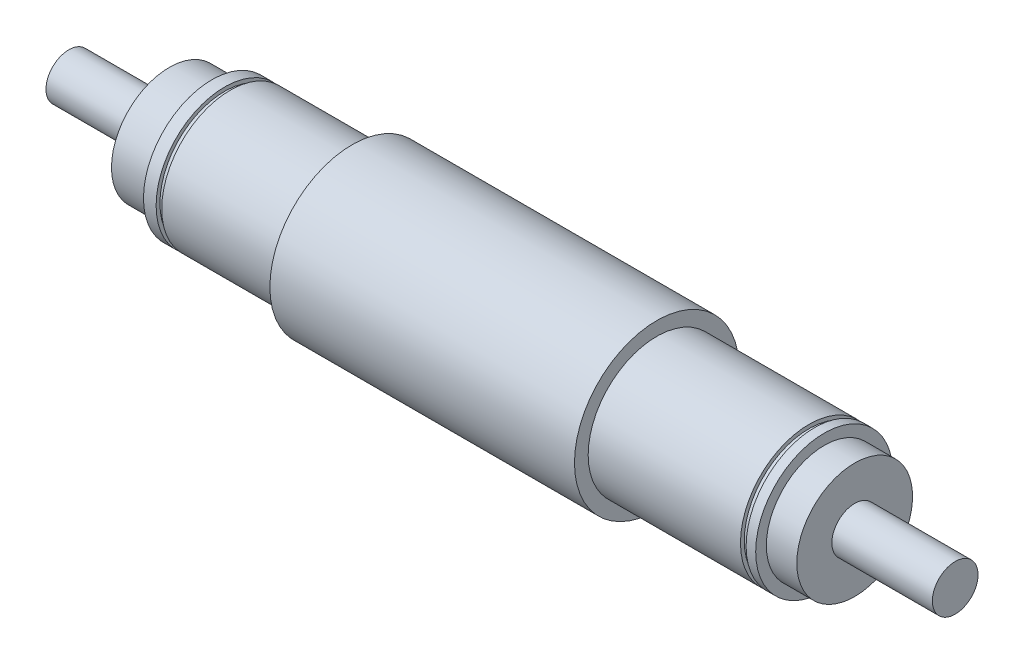
ISO-10303-21;
HEADER;
FILE_DESCRIPTION(('STEP AP214'),'2;1');
FILE_NAME('part.step','',(''),(''),'','','');
FILE_SCHEMA(('AUTOMOTIVE_DESIGN { 1 0 10303 214 1 1 1 1 }'));
ENDSEC;
DATA;
#1=APPLICATION_CONTEXT('core data for automotive mechanical design processes');
#2=APPLICATION_PROTOCOL_DEFINITION('international standard','automotive_design',2000,#1);
#3=PRODUCT_CONTEXT('',#1,'mechanical');
#4=PRODUCT('Part','Part','',(#3));
#5=PRODUCT_RELATED_PRODUCT_CATEGORY('part','',(#4));
#6=PRODUCT_DEFINITION_FORMATION('','',#4);
#7=PRODUCT_DEFINITION_CONTEXT('part definition',#1,'design');
#8=PRODUCT_DEFINITION('design','',#6,#7);
#9=PRODUCT_DEFINITION_SHAPE('','',#8);
#10=(LENGTH_UNIT() NAMED_UNIT(*) SI_UNIT(.MILLI.,.METRE.));
#11=(NAMED_UNIT(*) PLANE_ANGLE_UNIT() SI_UNIT($,.RADIAN.));
#12=(NAMED_UNIT(*) SI_UNIT($,.STERADIAN.) SOLID_ANGLE_UNIT());
#13=UNCERTAINTY_MEASURE_WITH_UNIT(LENGTH_MEASURE(1.E-05),#10,'distance_accuracy_value','');
#14=(GEOMETRIC_REPRESENTATION_CONTEXT(3) GLOBAL_UNCERTAINTY_ASSIGNED_CONTEXT((#13)) GLOBAL_UNIT_ASSIGNED_CONTEXT((#10,
#11,#12)) REPRESENTATION_CONTEXT('',''));
#15=CARTESIAN_POINT('',(0.,0.,0.));
#16=DIRECTION('',(0.,0.,1.));
#17=DIRECTION('',(1.,0.,0.));
#18=AXIS2_PLACEMENT_3D('',#15,#16,#17);
#19=CARTESIAN_POINT('',(0.,0.,0.));
#20=DIRECTION('',(-1.,0.,0.));
#21=DIRECTION('',(0.,0.,1.));
#22=AXIS2_PLACEMENT_3D('',#19,#20,#21);
#23=CYLINDRICAL_SURFACE('',#22,22.5);
#24=CARTESIAN_POINT('',(47.,0.,0.));
#25=DIRECTION('',(-1.,0.,0.));
#26=DIRECTION('',(0.,0.,1.));
#27=AXIS2_PLACEMENT_3D('',#24,#25,#26);
#28=CIRCLE('',#27,22.5);
#29=CARTESIAN_POINT('',(47.,0.,22.5));
#30=VERTEX_POINT('',#29);
#31=EDGE_CURVE('E61',#30,#30,#28,.T.);
#32=ORIENTED_EDGE('',*,*,#31,.F.);
#33=EDGE_LOOP('',(#32));
#34=FACE_BOUND('',#33,.T.);
#35=CARTESIAN_POINT('',(51.15,0.,0.));
#36=DIRECTION('',(-1.,0.,0.));
#37=DIRECTION('',(0.,0.,1.));
#38=AXIS2_PLACEMENT_3D('',#35,#36,#37);
#39=CIRCLE('',#38,22.5);
#40=CARTESIAN_POINT('',(51.15,0.,22.5));
#41=VERTEX_POINT('',#40);
#42=EDGE_CURVE('E106',#41,#41,#39,.T.);
#43=ORIENTED_EDGE('',*,*,#42,.T.);
#44=EDGE_LOOP('',(#43));
#45=FACE_BOUND('',#44,.T.);
#46=ADVANCED_FACE('F37',(#34,#45),#23,.T.);
#47=CARTESIAN_POINT('',(0.,0.,0.));
#48=DIRECTION('',(1.,0.,0.));
#49=DIRECTION('',(0.,0.,-1.));
#50=AXIS2_PLACEMENT_3D('',#47,#48,#49);
#51=PLANE('',#50);
#52=CARTESIAN_POINT('',(0.,0.,0.));
#53=DIRECTION('',(-1.,0.,0.));
#54=DIRECTION('',(0.,0.,1.));
#55=AXIS2_PLACEMENT_3D('',#52,#53,#54);
#56=CIRCLE('',#55,7.5);
#57=CARTESIAN_POINT('',(0.,0.,7.5));
#58=VERTEX_POINT('',#57);
#59=EDGE_CURVE('E10',#58,#58,#56,.T.);
#60=ORIENTED_EDGE('',*,*,#59,.T.);
#61=EDGE_LOOP('',(#60));
#62=FACE_BOUND('',#61,.T.);
#63=ADVANCED_FACE('F39',(#62),#51,.F.);
#64=CARTESIAN_POINT('',(0.,0.,0.));
#65=DIRECTION('',(-1.,0.,0.));
#66=DIRECTION('',(0.,0.,1.));
#67=AXIS2_PLACEMENT_3D('',#64,#65,#66);
#68=CYLINDRICAL_SURFACE('',#67,7.5);
#69=CARTESIAN_POINT('',(33.,0.,0.));
#70=DIRECTION('',(-1.,0.,0.));
#71=DIRECTION('',(0.,0.,1.));
#72=AXIS2_PLACEMENT_3D('',#69,#70,#71);
#73=CIRCLE('',#72,7.5);
#74=CARTESIAN_POINT('',(33.,0.,7.5));
#75=VERTEX_POINT('',#74);
#76=EDGE_CURVE('E45',#75,#75,#73,.T.);
#77=ORIENTED_EDGE('',*,*,#76,.T.);
#78=EDGE_LOOP('',(#77));
#79=FACE_BOUND('',#78,.T.);
#80=ORIENTED_EDGE('',*,*,#59,.F.);
#81=EDGE_LOOP('',(#80));
#82=FACE_BOUND('',#81,.T.);
#83=ADVANCED_FACE('F159',(#79,#82),#68,.T.);
#84=CARTESIAN_POINT('',(33.,7.5,0.));
#85=DIRECTION('',(1.,0.,0.));
#86=DIRECTION('',(0.,0.,-1.));
#87=AXIS2_PLACEMENT_3D('',#84,#85,#86);
#88=PLANE('',#87);
#89=ORIENTED_EDGE('',*,*,#76,.F.);
#90=EDGE_LOOP('',(#89));
#91=FACE_BOUND('',#90,.T.);
#92=CARTESIAN_POINT('',(33.,0.,0.));
#93=DIRECTION('',(-1.,0.,0.));
#94=DIRECTION('',(0.,0.,1.));
#95=AXIS2_PLACEMENT_3D('',#92,#93,#94);
#96=CIRCLE('',#95,19.);
#97=CARTESIAN_POINT('',(33.,0.,19.));
#98=VERTEX_POINT('',#97);
#99=EDGE_CURVE('E50',#98,#98,#96,.T.);
#100=ORIENTED_EDGE('',*,*,#99,.T.);
#101=EDGE_LOOP('',(#100));
#102=FACE_BOUND('',#101,.T.);
#103=ADVANCED_FACE('F275',(#91,#102),#88,.F.);
#104=CARTESIAN_POINT('',(0.,0.,0.));
#105=DIRECTION('',(-1.,0.,0.));
#106=DIRECTION('',(0.,0.,1.));
#107=AXIS2_PLACEMENT_3D('',#104,#105,#106);
#108=CYLINDRICAL_SURFACE('',#107,19.);
#109=ORIENTED_EDGE('',*,*,#99,.F.);
#110=EDGE_LOOP('',(#109));
#111=FACE_BOUND('',#110,.T.);
#112=CARTESIAN_POINT('',(47.,0.,0.));
#113=DIRECTION('',(-1.,0.,0.));
#114=DIRECTION('',(0.,0.,1.));
#115=AXIS2_PLACEMENT_3D('',#112,#113,#114);
#116=CIRCLE('',#115,19.);
#117=CARTESIAN_POINT('',(47.,0.,19.));
#118=VERTEX_POINT('',#117);
#119=EDGE_CURVE('E55',#118,#118,#116,.T.);
#120=ORIENTED_EDGE('',*,*,#119,.T.);
#121=EDGE_LOOP('',(#120));
#122=FACE_BOUND('',#121,.T.);
#123=ADVANCED_FACE('F148',(#111,#122),#108,.T.);
#124=CARTESIAN_POINT('',(47.,19.,0.));
#125=DIRECTION('',(1.,0.,0.));
#126=DIRECTION('',(0.,0.,-1.));
#127=AXIS2_PLACEMENT_3D('',#124,#125,#126);
#128=PLANE('',#127);
#129=ORIENTED_EDGE('',*,*,#119,.F.);
#130=EDGE_LOOP('',(#129));
#131=FACE_BOUND('',#130,.T.);
#132=ORIENTED_EDGE('',*,*,#31,.T.);
#133=EDGE_LOOP('',(#132));
#134=FACE_BOUND('',#133,.T.);
#135=ADVANCED_FACE('F138',(#131,#134),#128,.F.);
#136=CARTESIAN_POINT('',(51.15,22.5,0.));
#137=DIRECTION('',(1.,0.,0.));
#138=DIRECTION('',(0.,0.,-1.));
#139=AXIS2_PLACEMENT_3D('',#136,#137,#138);
#140=PLANE('',#139);
#141=CARTESIAN_POINT('',(51.15,0.,0.));
#142=DIRECTION('',(-1.,0.,0.));
#143=DIRECTION('',(0.,0.,1.));
#144=AXIS2_PLACEMENT_3D('',#141,#142,#143);
#145=CIRCLE('',#144,21.25);
#146=CARTESIAN_POINT('',(51.15,0.,21.25));
#147=VERTEX_POINT('',#146);
#148=EDGE_CURVE('E101',#147,#147,#145,.T.);
#149=ORIENTED_EDGE('',*,*,#148,.T.);
#150=EDGE_LOOP('',(#149));
#151=FACE_BOUND('',#150,.T.);
#152=ORIENTED_EDGE('',*,*,#42,.F.);
#153=EDGE_LOOP('',(#152));
#154=FACE_BOUND('',#153,.T.);
#155=ADVANCED_FACE('F135',(#151,#154),#140,.T.);
#156=CARTESIAN_POINT('',(0.,0.,0.));
#157=DIRECTION('',(-1.,0.,0.));
#158=DIRECTION('',(0.,0.,1.));
#159=AXIS2_PLACEMENT_3D('',#156,#157,#158);
#160=CYLINDRICAL_SURFACE('',#159,21.25);
#161=CARTESIAN_POINT('',(53.,0.,0.));
#162=DIRECTION('',(-1.,0.,0.));
#163=DIRECTION('',(0.,0.,1.));
#164=AXIS2_PLACEMENT_3D('',#161,#162,#163);
#165=CIRCLE('',#164,21.25);
#166=CARTESIAN_POINT('',(53.,0.,21.25));
#167=VERTEX_POINT('',#166);
#168=EDGE_CURVE('E122',#167,#167,#165,.T.);
#169=ORIENTED_EDGE('',*,*,#168,.T.);
#170=EDGE_LOOP('',(#169));
#171=FACE_BOUND('',#170,.T.);
#172=ORIENTED_EDGE('',*,*,#148,.F.);
#173=EDGE_LOOP('',(#172));
#174=FACE_BOUND('',#173,.T.);
#175=ADVANCED_FACE('F137',(#171,#174),#160,.T.);
#176=CARTESIAN_POINT('',(53.,22.5,0.));
#177=DIRECTION('',(-1.,0.,0.));
#178=DIRECTION('',(0.,0.,1.));
#179=AXIS2_PLACEMENT_3D('',#176,#177,#178);
#180=PLANE('',#179);
#181=CARTESIAN_POINT('',(53.,0.,0.));
#182=DIRECTION('',(-1.,0.,0.));
#183=DIRECTION('',(0.,0.,1.));
#184=AXIS2_PLACEMENT_3D('',#181,#182,#183);
#185=CIRCLE('',#184,22.5);
#186=CARTESIAN_POINT('',(53.,0.,22.5));
#187=VERTEX_POINT('',#186);
#188=EDGE_CURVE('E126',#187,#187,#185,.T.);
#189=ORIENTED_EDGE('',*,*,#188,.T.);
#190=EDGE_LOOP('',(#189));
#191=FACE_BOUND('',#190,.T.);
#192=ORIENTED_EDGE('',*,*,#168,.F.);
#193=EDGE_LOOP('',(#192));
#194=FACE_BOUND('',#193,.T.);
#195=ADVANCED_FACE('F145',(#191,#194),#180,.T.);
#196=CARTESIAN_POINT('',(93.,22.5,0.));
#197=DIRECTION('',(1.,0.,0.));
#198=DIRECTION('',(0.,0.,-1.));
#199=AXIS2_PLACEMENT_3D('',#196,#197,#198);
#200=PLANE('',#199);
#201=CARTESIAN_POINT('',(93.,0.,0.));
#202=DIRECTION('',(-1.,0.,0.));
#203=DIRECTION('',(0.,0.,1.));
#204=AXIS2_PLACEMENT_3D('',#201,#202,#203);
#205=CIRCLE('',#204,22.5);
#206=CARTESIAN_POINT('',(93.,0.,22.5));
#207=VERTEX_POINT('',#206);
#208=EDGE_CURVE('E65',#207,#207,#205,.T.);
#209=ORIENTED_EDGE('',*,*,#208,.F.);
#210=EDGE_LOOP('',(#209));
#211=FACE_BOUND('',#210,.T.);
#212=CARTESIAN_POINT('',(93.,0.,0.));
#213=DIRECTION('',(-1.,0.,0.));
#214=DIRECTION('',(0.,0.,1.));
#215=AXIS2_PLACEMENT_3D('',#212,#213,#214);
#216=CIRCLE('',#215,27.);
#217=CARTESIAN_POINT('',(93.,0.,27.));
#218=VERTEX_POINT('',#217);
#219=EDGE_CURVE('E69',#218,#218,#216,.T.);
#220=ORIENTED_EDGE('',*,*,#219,.T.);
#221=EDGE_LOOP('',(#220));
#222=FACE_BOUND('',#221,.T.);
#223=ADVANCED_FACE('F164',(#211,#222),#200,.F.);
#224=ORIENTED_EDGE('',*,*,#208,.T.);
#225=EDGE_LOOP('',(#224));
#226=FACE_BOUND('',#225,.T.);
#227=ORIENTED_EDGE('',*,*,#188,.F.);
#228=EDGE_LOOP('',(#227));
#229=FACE_BOUND('',#228,.T.);
#230=ADVANCED_FACE('F155',(#226,#229),#23,.T.);
#231=CARTESIAN_POINT('',(0.,0.,0.));
#232=DIRECTION('',(-1.,0.,0.));
#233=DIRECTION('',(0.,0.,1.));
#234=AXIS2_PLACEMENT_3D('',#231,#232,#233);
#235=CYLINDRICAL_SURFACE('',#234,27.);
#236=ORIENTED_EDGE('',*,*,#219,.F.);
#237=EDGE_LOOP('',(#236));
#238=FACE_BOUND('',#237,.T.);
#239=CARTESIAN_POINT('',(193.,0.,0.));
#240=DIRECTION('',(-1.,0.,0.));
#241=DIRECTION('',(0.,0.,1.));
#242=AXIS2_PLACEMENT_3D('',#239,#240,#241);
#243=CIRCLE('',#242,27.);
#244=CARTESIAN_POINT('',(193.,0.,27.));
#245=VERTEX_POINT('',#244);
#246=EDGE_CURVE('E73',#245,#245,#243,.T.);
#247=ORIENTED_EDGE('',*,*,#246,.T.);
#248=EDGE_LOOP('',(#247));
#249=FACE_BOUND('',#248,.T.);
#250=ADVANCED_FACE('F163',(#238,#249),#235,.T.);
#251=CARTESIAN_POINT('',(193.,27.,0.));
#252=DIRECTION('',(-1.,0.,0.));
#253=DIRECTION('',(0.,0.,1.));
#254=AXIS2_PLACEMENT_3D('',#251,#252,#253);
#255=PLANE('',#254);
#256=ORIENTED_EDGE('',*,*,#246,.F.);
#257=EDGE_LOOP('',(#256));
#258=FACE_BOUND('',#257,.T.);
#259=CARTESIAN_POINT('',(193.,0.,0.));
#260=DIRECTION('',(-1.,0.,0.));
#261=DIRECTION('',(0.,0.,1.));
#262=AXIS2_PLACEMENT_3D('',#259,#260,#261);
#263=CIRCLE('',#262,22.5);
#264=CARTESIAN_POINT('',(193.,0.,22.5));
#265=VERTEX_POINT('',#264);
#266=EDGE_CURVE('E77',#265,#265,#263,.T.);
#267=ORIENTED_EDGE('',*,*,#266,.T.);
#268=EDGE_LOOP('',(#267));
#269=FACE_BOUND('',#268,.T.);
#270=ADVANCED_FACE('F170',(#258,#269),#255,.F.);
#271=CARTESIAN_POINT('',(0.,0.,0.));
#272=DIRECTION('',(-1.,0.,0.));
#273=DIRECTION('',(0.,0.,1.));
#274=AXIS2_PLACEMENT_3D('',#271,#272,#273);
#275=CYLINDRICAL_SURFACE('',#274,22.5);
#276=ORIENTED_EDGE('',*,*,#266,.F.);
#277=EDGE_LOOP('',(#276));
#278=FACE_BOUND('',#277,.T.);
#279=CARTESIAN_POINT('',(243.,0.,0.));
#280=DIRECTION('',(-1.,0.,0.));
#281=DIRECTION('',(0.,0.,1.));
#282=AXIS2_PLACEMENT_3D('',#279,#280,#281);
#283=CIRCLE('',#282,22.5);
#284=CARTESIAN_POINT('',(243.,0.,22.5));
#285=VERTEX_POINT('',#284);
#286=EDGE_CURVE('E115',#285,#285,#283,.T.);
#287=ORIENTED_EDGE('',*,*,#286,.T.);
#288=EDGE_LOOP('',(#287));
#289=FACE_BOUND('',#288,.T.);
#290=ADVANCED_FACE('F211',(#278,#289),#275,.T.);
#291=CARTESIAN_POINT('',(243.,22.5,0.));
#292=DIRECTION('',(1.,0.,0.));
#293=DIRECTION('',(0.,0.,-1.));
#294=AXIS2_PLACEMENT_3D('',#291,#292,#293);
#295=PLANE('',#294);
#296=CARTESIAN_POINT('',(243.,0.,0.));
#297=DIRECTION('',(-1.,0.,0.));
#298=DIRECTION('',(0.,0.,1.));
#299=AXIS2_PLACEMENT_3D('',#296,#297,#298);
#300=CIRCLE('',#299,21.25);
#301=CARTESIAN_POINT('',(243.,0.,21.25));
#302=VERTEX_POINT('',#301);
#303=EDGE_CURVE('E102',#302,#302,#300,.T.);
#304=ORIENTED_EDGE('',*,*,#303,.T.);
#305=EDGE_LOOP('',(#304));
#306=FACE_BOUND('',#305,.T.);
#307=ORIENTED_EDGE('',*,*,#286,.F.);
#308=EDGE_LOOP('',(#307));
#309=FACE_BOUND('',#308,.T.);
#310=ADVANCED_FACE('F292',(#306,#309),#295,.T.);
#311=CARTESIAN_POINT('',(0.,0.,0.));
#312=DIRECTION('',(-1.,0.,0.));
#313=DIRECTION('',(0.,0.,1.));
#314=AXIS2_PLACEMENT_3D('',#311,#312,#313);
#315=CYLINDRICAL_SURFACE('',#314,21.25);
#316=CARTESIAN_POINT('',(244.85,0.,0.));
#317=DIRECTION('',(-1.,0.,0.));
#318=DIRECTION('',(0.,0.,1.));
#319=AXIS2_PLACEMENT_3D('',#316,#317,#318);
#320=CIRCLE('',#319,21.25);
#321=CARTESIAN_POINT('',(244.85,0.,21.25));
#322=VERTEX_POINT('',#321);
#323=EDGE_CURVE('E107',#322,#322,#320,.T.);
#324=ORIENTED_EDGE('',*,*,#323,.T.);
#325=EDGE_LOOP('',(#324));
#326=FACE_BOUND('',#325,.T.);
#327=ORIENTED_EDGE('',*,*,#303,.F.);
#328=EDGE_LOOP('',(#327));
#329=FACE_BOUND('',#328,.T.);
#330=ADVANCED_FACE('F298',(#326,#329),#315,.T.);
#331=CARTESIAN_POINT('',(244.85,22.5,0.));
#332=DIRECTION('',(-1.,0.,0.));
#333=DIRECTION('',(0.,0.,1.));
#334=AXIS2_PLACEMENT_3D('',#331,#332,#333);
#335=PLANE('',#334);
#336=CARTESIAN_POINT('',(244.85,0.,0.));
#337=DIRECTION('',(-1.,0.,0.));
#338=DIRECTION('',(0.,0.,1.));
#339=AXIS2_PLACEMENT_3D('',#336,#337,#338);
#340=CIRCLE('',#339,22.5);
#341=CARTESIAN_POINT('',(244.85,0.,22.5));
#342=VERTEX_POINT('',#341);
#343=EDGE_CURVE('E111',#342,#342,#340,.T.);
#344=ORIENTED_EDGE('',*,*,#343,.T.);
#345=EDGE_LOOP('',(#344));
#346=FACE_BOUND('',#345,.T.);
#347=ORIENTED_EDGE('',*,*,#323,.F.);
#348=EDGE_LOOP('',(#347));
#349=FACE_BOUND('',#348,.T.);
#350=ADVANCED_FACE('F257',(#346,#349),#335,.T.);
#351=CARTESIAN_POINT('',(291.,7.5,0.));
#352=DIRECTION('',(-1.,0.,0.));
#353=DIRECTION('',(0.,0.,1.));
#354=AXIS2_PLACEMENT_3D('',#351,#352,#353);
#355=PLANE('',#354);
#356=CARTESIAN_POINT('',(291.,0.,0.));
#357=DIRECTION('',(-1.,0.,0.));
#358=DIRECTION('',(0.,0.,1.));
#359=AXIS2_PLACEMENT_3D('',#356,#357,#358);
#360=CIRCLE('',#359,7.5);
#361=CARTESIAN_POINT('',(291.,0.,7.5));
#362=VERTEX_POINT('',#361);
#363=EDGE_CURVE('E97',#362,#362,#360,.T.);
#364=ORIENTED_EDGE('',*,*,#363,.F.);
#365=EDGE_LOOP('',(#364));
#366=FACE_BOUND('',#365,.T.);
#367=ADVANCED_FACE('F253',(#366),#355,.F.);
#368=CARTESIAN_POINT('',(0.,0.,0.));
#369=DIRECTION('',(-1.,0.,0.));
#370=DIRECTION('',(0.,0.,1.));
#371=AXIS2_PLACEMENT_3D('',#368,#369,#370);
#372=CYLINDRICAL_SURFACE('',#371,7.5);
#373=ORIENTED_EDGE('',*,*,#363,.T.);
#374=EDGE_LOOP('',(#373));
#375=FACE_BOUND('',#374,.T.);
#376=CARTESIAN_POINT('',(258.,0.,0.));
#377=DIRECTION('',(-1.,0.,0.));
#378=DIRECTION('',(0.,0.,1.));
#379=AXIS2_PLACEMENT_3D('',#376,#377,#378);
#380=CIRCLE('',#379,7.5);
#381=CARTESIAN_POINT('',(258.,0.,7.5));
#382=VERTEX_POINT('',#381);
#383=EDGE_CURVE('E93',#382,#382,#380,.T.);
#384=ORIENTED_EDGE('',*,*,#383,.F.);
#385=EDGE_LOOP('',(#384));
#386=FACE_BOUND('',#385,.T.);
#387=ADVANCED_FACE('F245',(#375,#386),#372,.T.);
#388=CARTESIAN_POINT('',(258.,19.,0.));
#389=DIRECTION('',(-1.,0.,0.));
#390=DIRECTION('',(0.,0.,1.));
#391=AXIS2_PLACEMENT_3D('',#388,#389,#390);
#392=PLANE('',#391);
#393=CARTESIAN_POINT('',(258.,0.,0.));
#394=DIRECTION('',(-1.,0.,0.));
#395=DIRECTION('',(0.,0.,1.));
#396=AXIS2_PLACEMENT_3D('',#393,#394,#395);
#397=CIRCLE('',#396,19.);
#398=CARTESIAN_POINT('',(258.,0.,19.));
#399=VERTEX_POINT('',#398);
#400=EDGE_CURVE('E89',#399,#399,#397,.T.);
#401=ORIENTED_EDGE('',*,*,#400,.F.);
#402=EDGE_LOOP('',(#401));
#403=FACE_BOUND('',#402,.T.);
#404=ORIENTED_EDGE('',*,*,#383,.T.);
#405=EDGE_LOOP('',(#404));
#406=FACE_BOUND('',#405,.T.);
#407=ADVANCED_FACE('F235',(#403,#406),#392,.F.);
#408=CARTESIAN_POINT('',(0.,0.,0.));
#409=DIRECTION('',(-1.,0.,0.));
#410=DIRECTION('',(0.,0.,1.));
#411=AXIS2_PLACEMENT_3D('',#408,#409,#410);
#412=CYLINDRICAL_SURFACE('',#411,19.);
#413=CARTESIAN_POINT('',(248.,0.,0.));
#414=DIRECTION('',(-1.,0.,0.));
#415=DIRECTION('',(0.,0.,1.));
#416=AXIS2_PLACEMENT_3D('',#413,#414,#415);
#417=CIRCLE('',#416,19.);
#418=CARTESIAN_POINT('',(248.,0.,19.));
#419=VERTEX_POINT('',#418);
#420=EDGE_CURVE('E85',#419,#419,#417,.T.);
#421=ORIENTED_EDGE('',*,*,#420,.F.);
#422=EDGE_LOOP('',(#421));
#423=FACE_BOUND('',#422,.T.);
#424=ORIENTED_EDGE('',*,*,#400,.T.);
#425=EDGE_LOOP('',(#424));
#426=FACE_BOUND('',#425,.T.);
#427=ADVANCED_FACE('F224',(#423,#426),#412,.T.);
#428=CARTESIAN_POINT('',(248.,22.5,0.));
#429=DIRECTION('',(-1.,0.,0.));
#430=DIRECTION('',(0.,0.,1.));
#431=AXIS2_PLACEMENT_3D('',#428,#429,#430);
#432=PLANE('',#431);
#433=CARTESIAN_POINT('',(248.,0.,0.));
#434=DIRECTION('',(-1.,0.,0.));
#435=DIRECTION('',(0.,0.,1.));
#436=AXIS2_PLACEMENT_3D('',#433,#434,#435);
#437=CIRCLE('',#436,22.5);
#438=CARTESIAN_POINT('',(248.,0.,22.5));
#439=VERTEX_POINT('',#438);
#440=EDGE_CURVE('E81',#439,#439,#437,.T.);
#441=ORIENTED_EDGE('',*,*,#440,.F.);
#442=EDGE_LOOP('',(#441));
#443=FACE_BOUND('',#442,.T.);
#444=ORIENTED_EDGE('',*,*,#420,.T.);
#445=EDGE_LOOP('',(#444));
#446=FACE_BOUND('',#445,.T.);
#447=ADVANCED_FACE('F219',(#443,#446),#432,.F.);
#448=ORIENTED_EDGE('',*,*,#440,.T.);
#449=EDGE_LOOP('',(#448));
#450=FACE_BOUND('',#449,.T.);
#451=ORIENTED_EDGE('',*,*,#343,.F.);
#452=EDGE_LOOP('',(#451));
#453=FACE_BOUND('',#452,.T.);
#454=ADVANCED_FACE('F223',(#450,#453),#275,.T.);
#455=CLOSED_SHELL('',(#46,#63,#83,#103,#123,#135,#155,#175,#195,#223,#230,#250,#270,#290,#310,
#330,#350,#367,#387,#407,#427,#447,#454));
#456=MANIFOLD_SOLID_BREP('B2',#455);
#457=ADVANCED_BREP_SHAPE_REPRESENTATION('',(#18,#456),#14);
#458=SHAPE_DEFINITION_REPRESENTATION(#9,#457);
ENDSEC;
END-ISO-10303-21;
